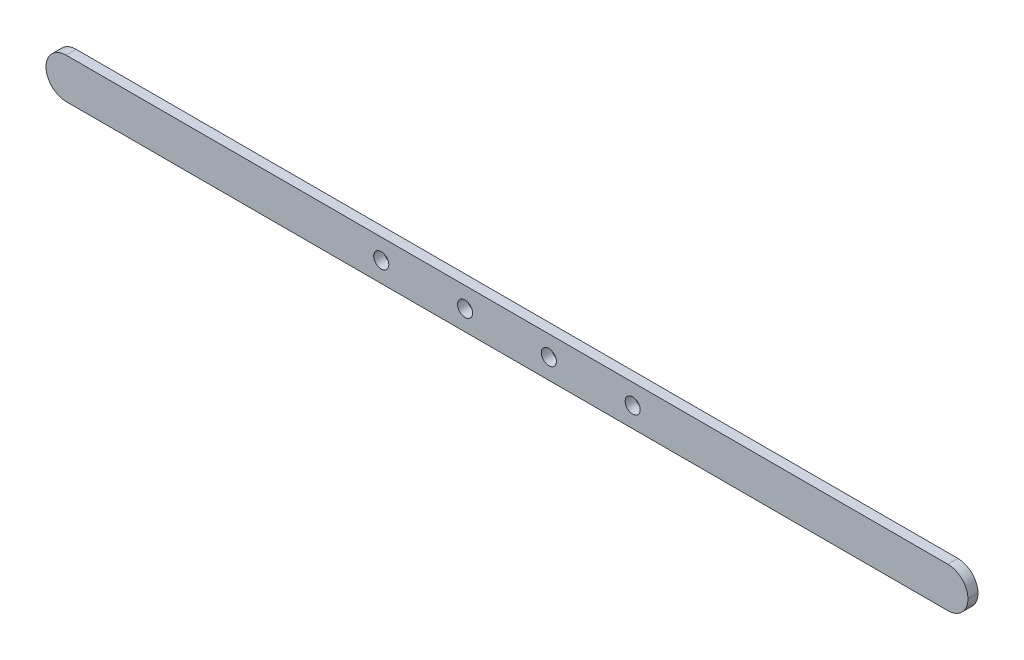
ISO-10303-21;
HEADER;
FILE_DESCRIPTION(('STEP AP214'),'2;1');
FILE_NAME('part.step','',(''),(''),'','','');
FILE_SCHEMA(('AUTOMOTIVE_DESIGN { 1 0 10303 214 1 1 1 1 }'));
ENDSEC;
DATA;
#1=APPLICATION_CONTEXT('core data for automotive mechanical design processes');
#2=APPLICATION_PROTOCOL_DEFINITION('international standard','automotive_design',2000,#1);
#3=PRODUCT_CONTEXT('',#1,'mechanical');
#4=PRODUCT('Part','Part','',(#3));
#5=PRODUCT_RELATED_PRODUCT_CATEGORY('part','',(#4));
#6=PRODUCT_DEFINITION_FORMATION('','',#4);
#7=PRODUCT_DEFINITION_CONTEXT('part definition',#1,'design');
#8=PRODUCT_DEFINITION('design','',#6,#7);
#9=PRODUCT_DEFINITION_SHAPE('','',#8);
#10=(LENGTH_UNIT() NAMED_UNIT(*) SI_UNIT(.MILLI.,.METRE.));
#11=(NAMED_UNIT(*) PLANE_ANGLE_UNIT() SI_UNIT($,.RADIAN.));
#12=(NAMED_UNIT(*) SI_UNIT($,.STERADIAN.) SOLID_ANGLE_UNIT());
#13=UNCERTAINTY_MEASURE_WITH_UNIT(LENGTH_MEASURE(1.E-05),#10,'distance_accuracy_value','');
#14=(GEOMETRIC_REPRESENTATION_CONTEXT(3) GLOBAL_UNCERTAINTY_ASSIGNED_CONTEXT((#13)) GLOBAL_UNIT_ASSIGNED_CONTEXT((#10,
#11,#12)) REPRESENTATION_CONTEXT('',''));
#15=CARTESIAN_POINT('',(0.,0.,0.));
#16=DIRECTION('',(0.,0.,1.));
#17=DIRECTION('',(1.,0.,0.));
#18=AXIS2_PLACEMENT_3D('',#15,#16,#17);
#19=CARTESIAN_POINT('',(0.,-12.,6.));
#20=DIRECTION('',(0.,1.,0.));
#21=DIRECTION('',(-1.,0.,0.));
#22=AXIS2_PLACEMENT_3D('',#19,#20,#21);
#23=PLANE('',#22);
#24=DIRECTION('',(1.,0.,0.));
#25=VECTOR('',#24,1.);
#26=CARTESIAN_POINT('',(0.,-12.,6.));
#27=LINE('',#26,#25);
#28=CARTESIAN_POINT('',(-263.,-12.,6.));
#29=VERTEX_POINT('',#28);
#30=CARTESIAN_POINT('',(263.,-12.,6.));
#31=VERTEX_POINT('',#30);
#32=EDGE_CURVE('E121',#29,#31,#27,.T.);
#33=ORIENTED_EDGE('',*,*,#32,.F.);
#34=DIRECTION('',(0.,0.,-1.));
#35=VECTOR('',#34,1.);
#36=CARTESIAN_POINT('',(-263.,-12.,0.));
#37=LINE('',#36,#35);
#38=CARTESIAN_POINT('',(-263.,-12.,0.));
#39=VERTEX_POINT('',#38);
#40=EDGE_CURVE('E106',#29,#39,#37,.T.);
#41=ORIENTED_EDGE('',*,*,#40,.T.);
#42=DIRECTION('',(1.,0.,0.));
#43=VECTOR('',#42,1.);
#44=CARTESIAN_POINT('',(0.,-12.,0.));
#45=LINE('',#44,#43);
#46=CARTESIAN_POINT('',(263.,-12.,0.));
#47=VERTEX_POINT('',#46);
#48=EDGE_CURVE('E118',#39,#47,#45,.T.);
#49=ORIENTED_EDGE('',*,*,#48,.T.);
#50=DIRECTION('',(0.,0.,-1.));
#51=VECTOR('',#50,1.);
#52=CARTESIAN_POINT('',(263.,-12.,6.));
#53=LINE('',#52,#51);
#54=EDGE_CURVE('E124',#47,#31,#53,.F.);
#55=ORIENTED_EDGE('',*,*,#54,.T.);
#56=EDGE_LOOP('',(#33,#41,#49,#55));
#57=FACE_BOUND('',#56,.T.);
#58=ADVANCED_FACE('F47',(#57),#23,.F.);
#59=CARTESIAN_POINT('',(0.,12.,6.));
#60=DIRECTION('',(0.,1.,0.));
#61=DIRECTION('',(-1.,0.,0.));
#62=AXIS2_PLACEMENT_3D('',#59,#60,#61);
#63=PLANE('',#62);
#64=DIRECTION('',(1.,0.,0.));
#65=VECTOR('',#64,1.);
#66=CARTESIAN_POINT('',(0.,12.,0.));
#67=LINE('',#66,#65);
#68=CARTESIAN_POINT('',(-263.,12.,0.));
#69=VERTEX_POINT('',#68);
#70=CARTESIAN_POINT('',(263.,12.,0.));
#71=VERTEX_POINT('',#70);
#72=EDGE_CURVE('E129',#69,#71,#67,.T.);
#73=ORIENTED_EDGE('',*,*,#72,.F.);
#74=DIRECTION('',(0.,0.,-1.));
#75=VECTOR('',#74,1.);
#76=CARTESIAN_POINT('',(-263.,12.,6.));
#77=LINE('',#76,#75);
#78=CARTESIAN_POINT('',(-263.,12.,6.));
#79=VERTEX_POINT('',#78);
#80=EDGE_CURVE('E11',#69,#79,#77,.F.);
#81=ORIENTED_EDGE('',*,*,#80,.T.);
#82=DIRECTION('',(1.,0.,0.));
#83=VECTOR('',#82,1.);
#84=CARTESIAN_POINT('',(0.,12.,6.));
#85=LINE('',#84,#83);
#86=CARTESIAN_POINT('',(263.,12.,6.));
#87=VERTEX_POINT('',#86);
#88=EDGE_CURVE('E143',#79,#87,#85,.T.);
#89=ORIENTED_EDGE('',*,*,#88,.T.);
#90=DIRECTION('',(0.,0.,-1.));
#91=VECTOR('',#90,1.);
#92=CARTESIAN_POINT('',(263.,12.,0.));
#93=LINE('',#92,#91);
#94=EDGE_CURVE('E57',#87,#71,#93,.T.);
#95=ORIENTED_EDGE('',*,*,#94,.T.);
#96=EDGE_LOOP('',(#73,#81,#89,#95));
#97=FACE_BOUND('',#96,.T.);
#98=ADVANCED_FACE('F210',(#97),#63,.T.);
#99=CARTESIAN_POINT('',(-25.,-7.00030991244604E-13,6.));
#100=DIRECTION('',(0.,0.,-1.));
#101=DIRECTION('',(-1.,0.,0.));
#102=AXIS2_PLACEMENT_3D('',#99,#100,#101);
#103=CYLINDRICAL_SURFACE('',#102,4.5);
#104=CARTESIAN_POINT('',(-25.,-7.00030991244604E-13,6.));
#105=DIRECTION('',(0.,0.,1.));
#106=DIRECTION('',(1.,0.,0.));
#107=AXIS2_PLACEMENT_3D('',#104,#105,#106);
#108=CIRCLE('',#107,4.5);
#109=CARTESIAN_POINT('',(-20.5,-7.00030991244604E-13,6.));
#110=VERTEX_POINT('',#109);
#111=EDGE_CURVE('E179',#110,#110,#108,.T.);
#112=ORIENTED_EDGE('',*,*,#111,.T.);
#113=EDGE_LOOP('',(#112));
#114=FACE_BOUND('',#113,.T.);
#115=CARTESIAN_POINT('',(-25.,-7.00030991244604E-13,0.));
#116=DIRECTION('',(0.,0.,1.));
#117=DIRECTION('',(1.,0.,0.));
#118=AXIS2_PLACEMENT_3D('',#115,#116,#117);
#119=CIRCLE('',#118,4.5);
#120=CARTESIAN_POINT('',(-20.5,-7.00030991244604E-13,0.));
#121=VERTEX_POINT('',#120);
#122=EDGE_CURVE('E130',#121,#121,#119,.T.);
#123=ORIENTED_EDGE('',*,*,#122,.F.);
#124=EDGE_LOOP('',(#123));
#125=FACE_BOUND('',#124,.T.);
#126=ADVANCED_FACE('F200',(#114,#125),#103,.F.);
#127=CARTESIAN_POINT('',(-75.,-1.04917912512892E-12,6.));
#128=DIRECTION('',(0.,0.,-1.));
#129=DIRECTION('',(-1.,0.,0.));
#130=AXIS2_PLACEMENT_3D('',#127,#128,#129);
#131=CYLINDRICAL_SURFACE('',#130,4.5);
#132=CARTESIAN_POINT('',(-75.,-1.04917912512892E-12,6.));
#133=DIRECTION('',(0.,0.,1.));
#134=DIRECTION('',(1.,0.,0.));
#135=AXIS2_PLACEMENT_3D('',#132,#133,#134);
#136=CIRCLE('',#135,4.5);
#137=CARTESIAN_POINT('',(-70.5,-1.04917912512892E-12,6.));
#138=VERTEX_POINT('',#137);
#139=EDGE_CURVE('E185',#138,#138,#136,.T.);
#140=ORIENTED_EDGE('',*,*,#139,.T.);
#141=EDGE_LOOP('',(#140));
#142=FACE_BOUND('',#141,.T.);
#143=CARTESIAN_POINT('',(-75.,-1.04917912512892E-12,0.));
#144=DIRECTION('',(0.,0.,1.));
#145=DIRECTION('',(1.,0.,0.));
#146=AXIS2_PLACEMENT_3D('',#143,#144,#145);
#147=CIRCLE('',#146,4.5);
#148=CARTESIAN_POINT('',(-70.5,-1.04917912512892E-12,0.));
#149=VERTEX_POINT('',#148);
#150=EDGE_CURVE('E138',#149,#149,#147,.T.);
#151=ORIENTED_EDGE('',*,*,#150,.F.);
#152=EDGE_LOOP('',(#151));
#153=FACE_BOUND('',#152,.T.);
#154=ADVANCED_FACE('F197',(#142,#153),#131,.F.);
#155=CARTESIAN_POINT('',(25.,-3.5088285736029E-13,6.));
#156=DIRECTION('',(0.,0.,-1.));
#157=DIRECTION('',(-1.,0.,0.));
#158=AXIS2_PLACEMENT_3D('',#155,#156,#157);
#159=CYLINDRICAL_SURFACE('',#158,4.5);
#160=CARTESIAN_POINT('',(25.,-3.5088285736029E-13,6.));
#161=DIRECTION('',(0.,0.,1.));
#162=DIRECTION('',(1.,0.,0.));
#163=AXIS2_PLACEMENT_3D('',#160,#161,#162);
#164=CIRCLE('',#163,4.5);
#165=CARTESIAN_POINT('',(29.5,-3.5088285736029E-13,6.));
#166=VERTEX_POINT('',#165);
#167=EDGE_CURVE('E239',#166,#166,#164,.T.);
#168=ORIENTED_EDGE('',*,*,#167,.T.);
#169=EDGE_LOOP('',(#168));
#170=FACE_BOUND('',#169,.T.);
#171=CARTESIAN_POINT('',(25.,-3.5088285736029E-13,0.));
#172=DIRECTION('',(0.,0.,1.));
#173=DIRECTION('',(1.,0.,0.));
#174=AXIS2_PLACEMENT_3D('',#171,#172,#173);
#175=CIRCLE('',#174,4.5);
#176=CARTESIAN_POINT('',(29.5,-3.5088285736029E-13,0.));
#177=VERTEX_POINT('',#176);
#178=EDGE_CURVE('E168',#177,#177,#175,.T.);
#179=ORIENTED_EDGE('',*,*,#178,.F.);
#180=EDGE_LOOP('',(#179));
#181=FACE_BOUND('',#180,.T.);
#182=ADVANCED_FACE('F199',(#170,#181),#159,.F.);
#183=CARTESIAN_POINT('',(75.,0.,6.));
#184=DIRECTION('',(0.,0.,-1.));
#185=DIRECTION('',(-1.,0.,0.));
#186=AXIS2_PLACEMENT_3D('',#183,#184,#185);
#187=CYLINDRICAL_SURFACE('',#186,4.5);
#188=CARTESIAN_POINT('',(75.,0.,6.));
#189=DIRECTION('',(0.,0.,1.));
#190=DIRECTION('',(1.,0.,0.));
#191=AXIS2_PLACEMENT_3D('',#188,#189,#190);
#192=CIRCLE('',#191,4.5);
#193=CARTESIAN_POINT('',(79.5,0.,6.));
#194=VERTEX_POINT('',#193);
#195=EDGE_CURVE('E135',#194,#194,#192,.T.);
#196=ORIENTED_EDGE('',*,*,#195,.T.);
#197=EDGE_LOOP('',(#196));
#198=FACE_BOUND('',#197,.T.);
#199=CARTESIAN_POINT('',(75.,0.,0.));
#200=DIRECTION('',(0.,0.,1.));
#201=DIRECTION('',(1.,0.,0.));
#202=AXIS2_PLACEMENT_3D('',#199,#200,#201);
#203=CIRCLE('',#202,4.5);
#204=CARTESIAN_POINT('',(79.5,0.,0.));
#205=VERTEX_POINT('',#204);
#206=EDGE_CURVE('E164',#205,#205,#203,.T.);
#207=ORIENTED_EDGE('',*,*,#206,.F.);
#208=EDGE_LOOP('',(#207));
#209=FACE_BOUND('',#208,.T.);
#210=ADVANCED_FACE('F207',(#198,#209),#187,.F.);
#211=CARTESIAN_POINT('',(0.,0.,6.));
#212=DIRECTION('',(0.,0.,1.));
#213=DIRECTION('',(1.,0.,0.));
#214=AXIS2_PLACEMENT_3D('',#211,#212,#213);
#215=PLANE('',#214);
#216=ORIENTED_EDGE('',*,*,#195,.F.);
#217=EDGE_LOOP('',(#216));
#218=FACE_BOUND('',#217,.T.);
#219=ORIENTED_EDGE('',*,*,#167,.F.);
#220=EDGE_LOOP('',(#219));
#221=FACE_BOUND('',#220,.T.);
#222=ORIENTED_EDGE('',*,*,#139,.F.);
#223=EDGE_LOOP('',(#222));
#224=FACE_BOUND('',#223,.T.);
#225=ORIENTED_EDGE('',*,*,#111,.F.);
#226=EDGE_LOOP('',(#225));
#227=FACE_BOUND('',#226,.T.);
#228=CARTESIAN_POINT('',(-263.,0.,6.));
#229=DIRECTION('',(0.,0.,1.));
#230=DIRECTION('',(1.,0.,0.));
#231=AXIS2_PLACEMENT_3D('',#228,#229,#230);
#232=CIRCLE('',#231,12.);
#233=CARTESIAN_POINT('',(-275.,0.,6.));
#234=VERTEX_POINT('',#233);
#235=EDGE_CURVE('E65',#79,#234,#232,.T.);
#236=ORIENTED_EDGE('',*,*,#235,.T.);
#237=CARTESIAN_POINT('',(-263.,0.,6.));
#238=DIRECTION('',(0.,0.,1.));
#239=DIRECTION('',(1.,0.,0.));
#240=AXIS2_PLACEMENT_3D('',#237,#238,#239);
#241=CIRCLE('',#240,12.);
#242=EDGE_CURVE('E158',#234,#29,#241,.T.);
#243=ORIENTED_EDGE('',*,*,#242,.T.);
#244=ORIENTED_EDGE('',*,*,#32,.T.);
#245=CARTESIAN_POINT('',(263.,0.,6.));
#246=DIRECTION('',(0.,0.,1.));
#247=DIRECTION('',(1.,0.,0.));
#248=AXIS2_PLACEMENT_3D('',#245,#246,#247);
#249=CIRCLE('',#248,12.);
#250=CARTESIAN_POINT('',(275.,0.,6.));
#251=VERTEX_POINT('',#250);
#252=EDGE_CURVE('E112',#31,#251,#249,.T.);
#253=ORIENTED_EDGE('',*,*,#252,.T.);
#254=CARTESIAN_POINT('',(263.,0.,6.));
#255=DIRECTION('',(0.,0.,1.));
#256=DIRECTION('',(1.,0.,0.));
#257=AXIS2_PLACEMENT_3D('',#254,#255,#256);
#258=CIRCLE('',#257,12.);
#259=EDGE_CURVE('E71',#251,#87,#258,.T.);
#260=ORIENTED_EDGE('',*,*,#259,.T.);
#261=ORIENTED_EDGE('',*,*,#88,.F.);
#262=EDGE_LOOP('',(#236,#243,#244,#253,#260,#261));
#263=FACE_BOUND('',#262,.T.);
#264=ADVANCED_FACE('F177',(#218,#221,#224,#227,#263),#215,.T.);
#265=CARTESIAN_POINT('',(0.,0.,0.));
#266=DIRECTION('',(0.,0.,1.));
#267=DIRECTION('',(1.,0.,0.));
#268=AXIS2_PLACEMENT_3D('',#265,#266,#267);
#269=PLANE('',#268);
#270=ORIENTED_EDGE('',*,*,#206,.T.);
#271=EDGE_LOOP('',(#270));
#272=FACE_BOUND('',#271,.T.);
#273=ORIENTED_EDGE('',*,*,#178,.T.);
#274=EDGE_LOOP('',(#273));
#275=FACE_BOUND('',#274,.T.);
#276=ORIENTED_EDGE('',*,*,#150,.T.);
#277=EDGE_LOOP('',(#276));
#278=FACE_BOUND('',#277,.T.);
#279=ORIENTED_EDGE('',*,*,#122,.T.);
#280=EDGE_LOOP('',(#279));
#281=FACE_BOUND('',#280,.T.);
#282=ORIENTED_EDGE('',*,*,#48,.F.);
#283=CARTESIAN_POINT('',(-263.,0.,0.));
#284=DIRECTION('',(0.,0.,1.));
#285=DIRECTION('',(1.,0.,0.));
#286=AXIS2_PLACEMENT_3D('',#283,#284,#285);
#287=CIRCLE('',#286,12.);
#288=CARTESIAN_POINT('',(-275.,0.,0.));
#289=VERTEX_POINT('',#288);
#290=EDGE_CURVE('E102',#39,#289,#287,.F.);
#291=ORIENTED_EDGE('',*,*,#290,.T.);
#292=CARTESIAN_POINT('',(-263.,0.,0.));
#293=DIRECTION('',(0.,0.,1.));
#294=DIRECTION('',(1.,0.,0.));
#295=AXIS2_PLACEMENT_3D('',#292,#293,#294);
#296=CIRCLE('',#295,12.);
#297=EDGE_CURVE('E113',#289,#69,#296,.F.);
#298=ORIENTED_EDGE('',*,*,#297,.T.);
#299=ORIENTED_EDGE('',*,*,#72,.T.);
#300=CARTESIAN_POINT('',(263.,0.,0.));
#301=DIRECTION('',(0.,0.,1.));
#302=DIRECTION('',(1.,0.,0.));
#303=AXIS2_PLACEMENT_3D('',#300,#301,#302);
#304=CIRCLE('',#303,12.);
#305=CARTESIAN_POINT('',(275.,0.,0.));
#306=VERTEX_POINT('',#305);
#307=EDGE_CURVE('E147',#71,#306,#304,.F.);
#308=ORIENTED_EDGE('',*,*,#307,.T.);
#309=CARTESIAN_POINT('',(263.,0.,0.));
#310=DIRECTION('',(0.,0.,1.));
#311=DIRECTION('',(1.,0.,0.));
#312=AXIS2_PLACEMENT_3D('',#309,#310,#311);
#313=CIRCLE('',#312,12.);
#314=EDGE_CURVE('E123',#306,#47,#313,.F.);
#315=ORIENTED_EDGE('',*,*,#314,.T.);
#316=EDGE_LOOP('',(#282,#291,#298,#299,#308,#315));
#317=FACE_BOUND('',#316,.T.);
#318=ADVANCED_FACE('F126',(#272,#275,#278,#281,#317),#269,.F.);
#319=CARTESIAN_POINT('',(-263.,0.,6.));
#320=DIRECTION('',(0.,0.,-1.));
#321=DIRECTION('',(-1.,0.,0.));
#322=AXIS2_PLACEMENT_3D('',#319,#320,#321);
#323=CYLINDRICAL_SURFACE('',#322,12.);
#324=DIRECTION('',(0.,0.,-1.));
#325=VECTOR('',#324,1.);
#326=CARTESIAN_POINT('',(-275.,0.,6.));
#327=LINE('',#326,#325);
#328=EDGE_CURVE('E107',#234,#289,#327,.T.);
#329=ORIENTED_EDGE('',*,*,#328,.F.);
#330=ORIENTED_EDGE('',*,*,#235,.F.);
#331=ORIENTED_EDGE('',*,*,#80,.F.);
#332=ORIENTED_EDGE('',*,*,#297,.F.);
#333=EDGE_LOOP('',(#329,#330,#331,#332));
#334=FACE_BOUND('',#333,.T.);
#335=ADVANCED_FACE('F225',(#334),#323,.T.);
#336=CARTESIAN_POINT('',(-263.,0.,6.));
#337=DIRECTION('',(0.,0.,1.));
#338=DIRECTION('',(1.,0.,0.));
#339=AXIS2_PLACEMENT_3D('',#336,#337,#338);
#340=CYLINDRICAL_SURFACE('',#339,12.);
#341=ORIENTED_EDGE('',*,*,#242,.F.);
#342=ORIENTED_EDGE('',*,*,#328,.T.);
#343=ORIENTED_EDGE('',*,*,#290,.F.);
#344=ORIENTED_EDGE('',*,*,#40,.F.);
#345=EDGE_LOOP('',(#341,#342,#343,#344));
#346=FACE_BOUND('',#345,.T.);
#347=ADVANCED_FACE('F105',(#346),#340,.T.);
#348=CARTESIAN_POINT('',(263.,0.,6.));
#349=DIRECTION('',(0.,0.,-1.));
#350=DIRECTION('',(-1.,0.,0.));
#351=AXIS2_PLACEMENT_3D('',#348,#349,#350);
#352=CYLINDRICAL_SURFACE('',#351,12.);
#353=DIRECTION('',(0.,0.,-1.));
#354=VECTOR('',#353,1.);
#355=CARTESIAN_POINT('',(275.,0.,6.));
#356=LINE('',#355,#354);
#357=EDGE_CURVE('E51',#251,#306,#356,.T.);
#358=ORIENTED_EDGE('',*,*,#357,.F.);
#359=ORIENTED_EDGE('',*,*,#252,.F.);
#360=ORIENTED_EDGE('',*,*,#54,.F.);
#361=ORIENTED_EDGE('',*,*,#314,.F.);
#362=EDGE_LOOP('',(#358,#359,#360,#361));
#363=FACE_BOUND('',#362,.T.);
#364=ADVANCED_FACE('F49',(#363),#352,.T.);
#365=CARTESIAN_POINT('',(263.,0.,6.));
#366=DIRECTION('',(0.,0.,1.));
#367=DIRECTION('',(1.,0.,0.));
#368=AXIS2_PLACEMENT_3D('',#365,#366,#367);
#369=CYLINDRICAL_SURFACE('',#368,12.);
#370=ORIENTED_EDGE('',*,*,#259,.F.);
#371=ORIENTED_EDGE('',*,*,#357,.T.);
#372=ORIENTED_EDGE('',*,*,#307,.F.);
#373=ORIENTED_EDGE('',*,*,#94,.F.);
#374=EDGE_LOOP('',(#370,#371,#372,#373));
#375=FACE_BOUND('',#374,.T.);
#376=ADVANCED_FACE('F173',(#375),#369,.T.);
#377=CLOSED_SHELL('',(#58,#98,#126,#154,#182,#210,#264,#318,#335,#347,#364,#376));
#378=MANIFOLD_SOLID_BREP('B2',#377);
#379=ADVANCED_BREP_SHAPE_REPRESENTATION('',(#18,#378),#14);
#380=SHAPE_DEFINITION_REPRESENTATION(#9,#379);
ENDSEC;
END-ISO-10303-21;
